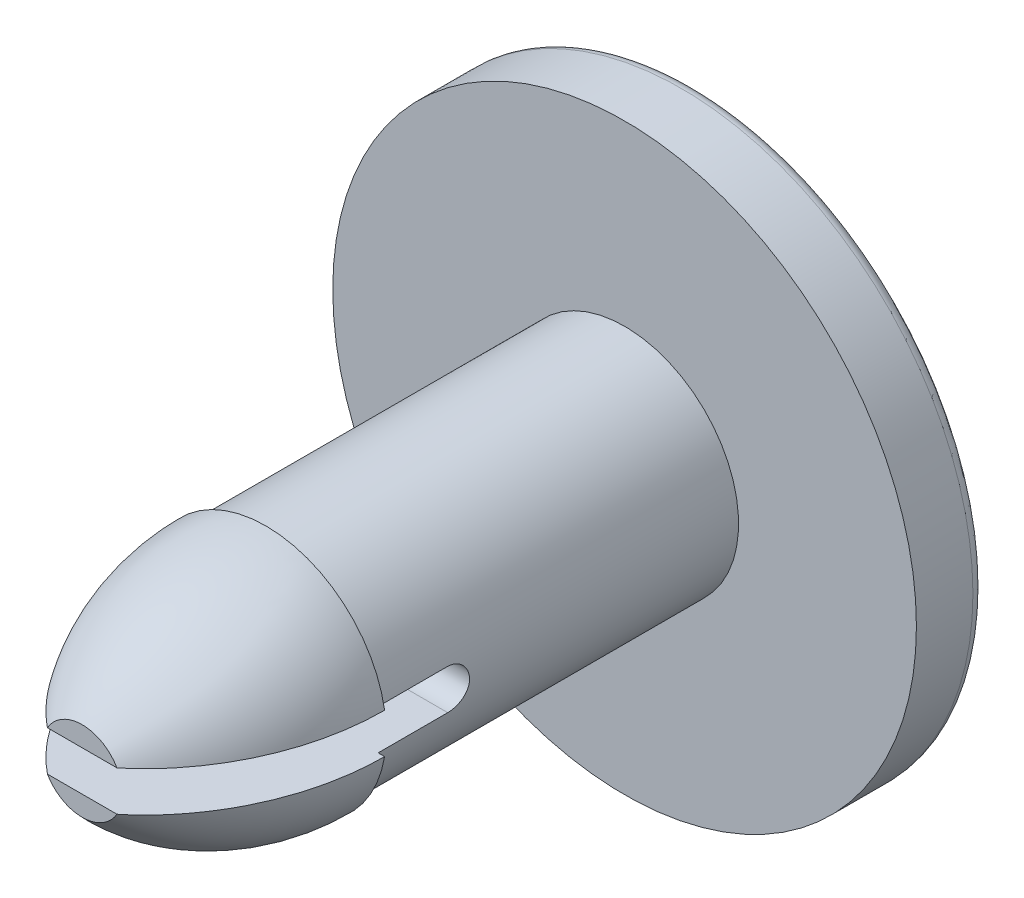
ISO-10303-21;
HEADER;
FILE_DESCRIPTION(('STEP AP214'),'2;1');
FILE_NAME('part.step','',(''),(''),'','','');
FILE_SCHEMA(('AUTOMOTIVE_DESIGN { 1 0 10303 214 1 1 1 1 }'));
ENDSEC;
DATA;
#1=APPLICATION_CONTEXT('core data for automotive mechanical design processes');
#2=APPLICATION_PROTOCOL_DEFINITION('international standard','automotive_design',2000,#1);
#3=PRODUCT_CONTEXT('',#1,'mechanical');
#4=PRODUCT('Part','Part','',(#3));
#5=PRODUCT_RELATED_PRODUCT_CATEGORY('part','',(#4));
#6=PRODUCT_DEFINITION_FORMATION('','',#4);
#7=PRODUCT_DEFINITION_CONTEXT('part definition',#1,'design');
#8=PRODUCT_DEFINITION('design','',#6,#7);
#9=PRODUCT_DEFINITION_SHAPE('','',#8);
#10=(LENGTH_UNIT() NAMED_UNIT(*) SI_UNIT(.MILLI.,.METRE.));
#11=(NAMED_UNIT(*) PLANE_ANGLE_UNIT() SI_UNIT($,.RADIAN.));
#12=(NAMED_UNIT(*) SI_UNIT($,.STERADIAN.) SOLID_ANGLE_UNIT());
#13=UNCERTAINTY_MEASURE_WITH_UNIT(LENGTH_MEASURE(1.E-05),#10,'distance_accuracy_value','');
#14=(GEOMETRIC_REPRESENTATION_CONTEXT(3) GLOBAL_UNCERTAINTY_ASSIGNED_CONTEXT((#13)) GLOBAL_UNIT_ASSIGNED_CONTEXT((#10,
#11,#12)) REPRESENTATION_CONTEXT('',''));
#15=CARTESIAN_POINT('',(0.,0.,0.));
#16=DIRECTION('',(0.,0.,1.));
#17=DIRECTION('',(1.,0.,0.));
#18=AXIS2_PLACEMENT_3D('',#15,#16,#17);
#19=CARTESIAN_POINT('',(0.,0.,15.7988));
#20=DIRECTION('',(0.,0.,1.));
#21=DIRECTION('',(1.,0.,0.));
#22=AXIS2_PLACEMENT_3D('',#19,#20,#21);
#23=PLANE('',#22);
#24=DIRECTION('',(1.,0.,0.));
#25=VECTOR('',#24,1.);
#26=CARTESIAN_POINT('',(-7.5438,0.518583333333335,15.7988));
#27=LINE('',#26,#25);
#28=CARTESIAN_POINT('',(-0.898212681291753,0.518583333333335,15.7988));
#29=VERTEX_POINT('',#28);
#30=CARTESIAN_POINT('',(0.898212681304944,0.518583333333335,15.7988));
#31=VERTEX_POINT('',#30);
#32=EDGE_CURVE('E201',#29,#31,#27,.T.);
#33=ORIENTED_EDGE('',*,*,#32,.T.);
#34=CARTESIAN_POINT('',(0.,0.,15.7988));
#35=DIRECTION('',(0.,0.,-1.));
#36=DIRECTION('',(-1.,0.,0.));
#37=AXIS2_PLACEMENT_3D('',#34,#35,#36);
#38=CIRCLE('',#37,1.03716666666667);
#39=EDGE_CURVE('E158',#29,#31,#38,.T.);
#40=ORIENTED_EDGE('',*,*,#39,.F.);
#41=EDGE_LOOP('',(#33,#40));
#42=FACE_BOUND('',#41,.T.);
#43=ADVANCED_FACE('F39',(#42),#23,.T.);
#44=CARTESIAN_POINT('',(0.,0.,11.049));
#45=DIRECTION('',(0.,0.,-1.));
#46=DIRECTION('',(-1.,0.,0.));
#47=AXIS2_PLACEMENT_3D('',#44,#45,#46);
#48=DEGENERATE_TOROIDAL_SURFACE('',#47,3.36370299319728,6.47520299319728,.F.);
#49=CARTESIAN_POINT('',(0.,0.518583333333335,16.2312877845547));
#50=CARTESIAN_POINT('',(-0.0407264129127319,0.518583333333335,16.231275807815));
#51=CARTESIAN_POINT('',(-0.0814801404673032,0.518583333333335,16.2276080484462));
#52=CARTESIAN_POINT('',(-0.161991821460887,0.518583333333335,16.2137862378775));
#53=CARTESIAN_POINT('',(-0.20174372586801,0.518583333333335,16.2035996113095));
#54=CARTESIAN_POINT('',(-0.28539378906224,0.518583333333335,16.1766545321276));
#55=CARTESIAN_POINT('',(-0.329041860075124,0.518583333333335,16.1591498650331));
#56=CARTESIAN_POINT('',(-0.414482229003522,0.518583333333335,16.1200193953121));
#57=CARTESIAN_POINT('',(-0.456270802394296,0.518583333333335,16.0983857435605));
#58=CARTESIAN_POINT('',(-0.538494216710265,0.518583333333335,16.0521645739479));
#59=CARTESIAN_POINT('',(-0.578919240578408,0.518583333333335,16.0275598362332));
#60=CARTESIAN_POINT('',(-0.658373120750007,0.518583333333335,15.9762786505908));
#61=CARTESIAN_POINT('',(-0.697403056285305,0.518583333333335,15.9496038570284));
#62=CARTESIAN_POINT('',(-0.790884764690187,0.518583333333335,15.8827480789929));
#63=CARTESIAN_POINT('',(-0.844720856627003,0.518583333333335,15.8417074450807));
#64=CARTESIAN_POINT('',(-0.950306360734214,0.518583333333335,15.757014180395));
#65=CARTESIAN_POINT('',(-1.00205503311049,0.518583333333335,15.7133606369709));
#66=CARTESIAN_POINT('',(-1.15454295052778,0.518583333333335,15.5790214828739));
#67=CARTESIAN_POINT('',(-1.25240197811474,0.518583333333335,15.4850476081723));
#68=CARTESIAN_POINT('',(-1.44074748546284,0.518583333333335,15.2902905772841));
#69=CARTESIAN_POINT('',(-1.53124364214776,0.518583333333335,15.189516687886));
#70=CARTESIAN_POINT('',(-1.70497952899168,0.518583333333335,14.9820119862826));
#71=CARTESIAN_POINT('',(-1.78822363623625,0.518583333333335,14.8752848319746));
#72=CARTESIAN_POINT('',(-1.97095158925619,0.518583333333335,14.624119731363));
#73=CARTESIAN_POINT('',(-2.0679522036069,0.518583333333335,14.4778678366797));
#74=CARTESIAN_POINT('',(-2.24926450019187,0.518583333333335,14.1776366154759));
#75=CARTESIAN_POINT('',(-2.33357084744756,0.518583333333335,14.0236540760714));
#76=CARTESIAN_POINT('',(-2.48898247043954,0.518583333333335,13.7092454842928));
#77=CARTESIAN_POINT('',(-2.56009320100576,0.518583333333335,13.5488221279448));
#78=CARTESIAN_POINT('',(-2.68877745678832,0.518583333333335,13.2225675434815));
#79=CARTESIAN_POINT('',(-2.74634583204625,0.518583333333335,13.05673428527));
#80=CARTESIAN_POINT('',(-2.8476811148439,0.518583333333335,12.7205131210003));
#81=CARTESIAN_POINT('',(-2.89141794161705,0.518583333333335,12.5501161503398));
#82=CARTESIAN_POINT('',(-2.96466817080909,0.518583333333335,12.2062291770196));
#83=CARTESIAN_POINT('',(-2.9941764831191,0.518583333333335,12.0327380904529));
#84=CARTESIAN_POINT('',(-3.03875548143213,0.518583333333335,11.6839855612238));
#85=CARTESIAN_POINT('',(-3.05383226093596,0.518583333333335,11.508724897356));
#86=CARTESIAN_POINT('',(-3.06947955149315,0.518583333333335,11.1574921518692));
#87=CARTESIAN_POINT('',(-3.07004461092563,0.518583333333335,10.9815198277292));
#88=CARTESIAN_POINT('',(-3.05652376034,0.518583333333335,10.6267988284575));
#89=CARTESIAN_POINT('',(-3.04216025057819,0.518583333333335,10.4480606701983));
#90=CARTESIAN_POINT('',(-2.99843836333691,0.518583333333335,10.092364626086));
#91=CARTESIAN_POINT('',(-2.96907472774547,0.518583333333336,9.91540738670741));
#92=CARTESIAN_POINT('',(-2.89551917856703,0.518583333333336,9.56450863912886));
#93=CARTESIAN_POINT('',(-2.85131986150213,0.518583333333336,9.39056868231748));
#94=CARTESIAN_POINT('',(-2.74835122154622,0.518583333333336,9.04696507955554));
#95=CARTESIAN_POINT('',(-2.68957503293237,0.518583333333336,8.87730349032453));
#96=CARTESIAN_POINT('',(-2.55781748719599,0.518583333333336,8.5435609922402));
#97=CARTESIAN_POINT('',(-2.48483425263281,0.518583333333336,8.37948082433386));
#98=CARTESIAN_POINT('',(-2.32510097051018,0.518583333333336,8.05816529828079));
#99=CARTESIAN_POINT('',(-2.23835147738078,0.518583333333336,7.90092966479827));
#100=CARTESIAN_POINT('',(-2.05178680713929,0.518583333333336,7.59493939589653));
#101=CARTESIAN_POINT('',(-1.95200409835851,0.518583333333336,7.4461649620269));
#102=CARTESIAN_POINT('',(-1.7397125117805,0.518583333333336,7.15809509517974));
#103=CARTESIAN_POINT('',(-1.62721262726387,0.518583333333336,7.01879307381286));
#104=CARTESIAN_POINT('',(-1.43378276346113,0.518583333333336,6.80095889172777));
#105=CARTESIAN_POINT('',(-1.35662262876072,0.518583333333336,6.71905288089397));
#106=CARTESIAN_POINT('',(-1.1972612353243,0.518583333333336,6.56024999261713));
#107=CARTESIAN_POINT('',(-1.11506010662716,0.518583333333336,6.48335298606586));
#108=CARTESIAN_POINT('',(-0.989792252439972,0.518583333333336,6.37442419714963));
#109=CARTESIAN_POINT('',(-0.94879320426588,0.518583333333336,6.33999988144634));
#110=CARTESIAN_POINT('',(-0.865491244106908,0.518583333333336,6.2727715131478));
#111=CARTESIAN_POINT('',(-0.823188542697885,0.518583333333336,6.23996720108216));
#112=CARTESIAN_POINT('',(-0.737129281728739,0.518583333333336,6.17629560361508));
#113=CARTESIAN_POINT('',(-0.693372423828693,0.518583333333336,6.14542871950271));
#114=CARTESIAN_POINT('',(-0.604203534798896,0.518583333333336,6.08620669951445));
#115=CARTESIAN_POINT('',(-0.5587923317595,0.518583333333336,6.05785033072326));
#116=CARTESIAN_POINT('',(-0.465168333107206,0.518583333333336,6.00417076317695));
#117=CARTESIAN_POINT('',(-0.416921402374916,0.518583333333336,5.97890616774525));
#118=CARTESIAN_POINT('',(-0.317861784463709,0.518583333333336,5.93393875103579));
#119=CARTESIAN_POINT('',(-0.267053266184642,0.518583333333336,5.91422721619489));
#120=CARTESIAN_POINT('',(-0.174398829107425,0.518583333333336,5.88722058760614));
#121=CARTESIAN_POINT('',(-0.133101589112402,0.518583333333336,5.87813146387408));
#122=CARTESIAN_POINT('',(-0.0496292123505532,0.518583333333336,5.86727899520565));
#123=CARTESIAN_POINT('',(-0.00745769984292557,0.518583333333336,5.86548983721711));
#124=CARTESIAN_POINT('',(0.0764557507962241,0.518583333333336,5.8696524310324));
#125=CARTESIAN_POINT('',(0.118197825258675,0.518583333333336,5.8756016446359));
#126=CARTESIAN_POINT('',(0.200368425681853,0.518583333333336,5.89382076039526));
#127=CARTESIAN_POINT('',(0.240790646626667,0.518583333333336,5.90611729945816));
#128=CARTESIAN_POINT('',(0.331322097666327,0.518583333333336,5.93929309618665));
#129=CARTESIAN_POINT('',(0.380880830136704,0.518583333333336,5.96162286795935));
#130=CARTESIAN_POINT('',(0.477709610376274,0.518583333333336,6.01086101444558));
#131=CARTESIAN_POINT('',(0.524974483035573,0.518583333333336,6.03777917535016));
#132=CARTESIAN_POINT('',(0.617885852022556,0.518583333333336,6.09487763166931));
#133=CARTESIAN_POINT('',(0.663520071518955,0.518583333333336,6.12507768019658));
#134=CARTESIAN_POINT('',(0.753117213555999,0.518583333333336,6.18775615933993));
#135=CARTESIAN_POINT('',(0.797081628172564,0.518583333333336,6.22023247841578));
#136=CARTESIAN_POINT('',(0.898444002978826,0.518583333333336,6.29849863657378));
#137=CARTESIAN_POINT('',(0.955269083996176,0.518583333333336,6.34502980065694));
#138=CARTESIAN_POINT('',(1.06661292292584,0.518583333333336,6.44078328658392));
#139=CARTESIAN_POINT('',(1.12113100542112,0.518583333333336,6.49000638700508));
#140=CARTESIAN_POINT('',(1.28153792135015,0.518583333333336,6.64125722979692));
#141=CARTESIAN_POINT('',(1.3841615471152,0.518583333333336,6.74677319073642));
#142=CARTESIAN_POINT('',(1.5806801923919,0.518583333333336,6.96509531641962));
#143=CARTESIAN_POINT('',(1.67459665497695,0.518583333333336,7.07788234574475));
#144=CARTESIAN_POINT('',(1.85384657684704,0.518583333333336,7.30997090116511));
#145=CARTESIAN_POINT('',(1.93918510626747,0.518583333333336,7.42926851395448));
#146=CARTESIAN_POINT('',(2.10293871534261,0.518583333333336,7.67639735644312));
#147=CARTESIAN_POINT('',(2.18115559389323,0.518583333333336,7.80435996822917));
#148=CARTESIAN_POINT('',(2.32818019895601,0.518583333333336,8.06557657178749));
#149=CARTESIAN_POINT('',(2.39698641931057,0.518583333333336,8.19883140617616));
#150=CARTESIAN_POINT('',(2.58888116870131,0.518583333333336,8.60548939807205));
#151=CARTESIAN_POINT('',(2.69750250204437,0.518583333333336,8.88587203469264));
#152=CARTESIAN_POINT('',(2.88964771397096,0.518583333333336,9.50976052334392));
#153=CARTESIAN_POINT('',(2.96536620768084,0.518583333333335,9.85567765519236));
#154=CARTESIAN_POINT('',(3.05864359426403,0.518583333333335,10.5552692528594));
#155=CARTESIAN_POINT('',(3.07619650339095,0.518583333333335,10.9089445130231));
#156=CARTESIAN_POINT('',(3.05250133638668,0.518583333333335,11.6197023602227));
#157=CARTESIAN_POINT('',(3.01036227032898,0.518583333333335,11.9767558675326));
#158=CARTESIAN_POINT('',(2.86668707844602,0.518583333333335,12.6791899421931));
#159=CARTESIAN_POINT('',(2.76506533618463,0.518583333333335,13.0245529232552));
#160=CARTESIAN_POINT('',(2.50461603092907,0.518583333333335,13.6937240398372));
#161=CARTESIAN_POINT('',(2.34572391031139,0.518583333333335,14.0175073598227));
#162=CARTESIAN_POINT('',(2.06795457436586,0.518583333333335,14.4780626640727));
#163=CARTESIAN_POINT('',(1.96899271478333,0.518583333333335,14.6271642386819));
#164=CARTESIAN_POINT('',(1.75832403916917,0.518583333333335,14.9160166534445));
#165=CARTESIAN_POINT('',(1.64662587993108,0.518583333333335,15.0557737437025));
#166=CARTESIAN_POINT('',(1.44175746459423,0.518583333333335,15.2890031721587));
#167=CARTESIAN_POINT('',(1.3514363662105,0.518583333333335,15.3849842851889));
#168=CARTESIAN_POINT('',(1.21055811821162,0.518583333333335,15.5239125244275));
#169=CARTESIAN_POINT('',(1.16257824936559,0.518583333333335,15.5694840577142));
#170=CARTESIAN_POINT('',(1.06482016108486,0.518583333333335,15.6586347126673));
#171=CARTESIAN_POINT('',(1.01504244614222,0.518583333333335,15.7022143856102));
#172=CARTESIAN_POINT('',(0.913102668298245,0.518583333333335,15.7874651385858));
#173=CARTESIAN_POINT('',(0.86092314035411,0.518583333333335,15.8291154426546));
#174=CARTESIAN_POINT('',(0.75430656837218,0.518583333333335,15.9095860159839));
#175=CARTESIAN_POINT('',(0.699866562927882,0.518583333333335,15.9484023764751));
#176=CARTESIAN_POINT('',(0.588662451524345,0.518583333333335,16.0219579758186));
#177=CARTESIAN_POINT('',(0.531912869991846,0.518583333333335,16.0567185832468));
#178=CARTESIAN_POINT('',(0.444387730764145,0.518583333333335,16.104318591653));
#179=CARTESIAN_POINT('',(0.414844055320709,0.518583333333335,16.1194152913019));
#180=CARTESIAN_POINT('',(0.354830181135616,0.518583333333335,16.1476204201236));
#181=CARTESIAN_POINT('',(0.32436066513663,0.518583333333335,16.1607302736955));
#182=CARTESIAN_POINT('',(0.26986073404642,0.518583333333335,16.1814669783519));
#183=CARTESIAN_POINT('',(0.246045228508195,0.518583333333335,16.1896540990776));
#184=CARTESIAN_POINT('',(0.19783512986225,0.518583333333335,16.2041266804244));
#185=CARTESIAN_POINT('',(0.173440593290915,0.518583333333335,16.2104123258879));
#186=CARTESIAN_POINT('',(0.124339788511118,0.518583333333335,16.2206404086077));
#187=CARTESIAN_POINT('',(0.0996371100177838,0.518583333333335,16.224599663777));
#188=CARTESIAN_POINT('',(0.0499596506241167,0.518583333333335,16.2299265837947));
#189=CARTESIAN_POINT('',(0.0249849654017718,0.518583333333335,16.2312951320818));
#190=CARTESIAN_POINT('',(0.,0.518583333333335,16.2312877845547));
#191=B_SPLINE_CURVE_WITH_KNOTS('',3,(#49,#50,#51,#52,#53,#54,#55,#56,#57,#58,#59,#60,#61,#62,
#63,#64,#65,#66,#67,#68,#69,#70,#71,#72,#73,#74,#75,#76,#77,#78,#79,#80,#81,#82,#83,#84,#85,#86,
#87,#88,#89,#90,#91,#92,#93,#94,#95,#96,#97,#98,#99,#100,#101,#102,#103,#104,#105,#106,#107,
#108,#109,#110,#111,#112,#113,#114,#115,#116,#117,#118,#119,#120,#121,#122,#123,#124,#125,#126,
#127,#128,#129,#130,#131,#132,#133,#134,#135,#136,#137,#138,#139,#140,#141,#142,#143,#144,#145,
#146,#147,#148,#149,#150,#151,#152,#153,#154,#155,#156,#157,#158,#159,#160,#161,#162,#163,#164,
#165,#166,#167,#168,#169,#170,#171,#172,#173,#174,#175,#176,#177,#178,#179,#180,#181,#182,#183,
#184,#185,#186,#187,#188,#189,#190),.UNSPECIFIED.,.T.,.F.,(4,2,2,2,2,2,2,2,2,2,2,2,2,2,2,2,2,2,
2,2,2,2,2,2,2,2,2,2,2,2,2,2,2,2,2,2,2,2,2,2,2,2,2,2,2,2,2,2,2,2,2,2,2,2,2,2,2,2,2,2,2,2,2,2,2,2,
2,2,2,2,4),(0.,0.122093544579893,0.244802017027031,0.385558203600591,0.526584679348972,
0.668471744728991,0.81024656077593,1.01322151904397,1.21626779192196,1.6228142819017,
2.02881751897094,2.43457398382444,2.9603935602371,3.48643350802382,4.01225551358537,
4.53827715942247,5.06543504965097,5.59278138569053,6.11990495920832,6.64722655445262,
7.18453230282875,7.7220265265861,8.25978937686671,8.79780599668946,9.33589376295792,
9.87395986347406,10.4107102271114,10.9470833607764,11.2844860093013,11.6218799577523,
11.7824533038558,11.9430008475096,12.1035815355239,12.2640829196981,12.4272663332283,
12.5901922434959,12.7165410473725,12.8424426861643,12.9683030393952,13.0946959192779,
13.2573741330503,13.4204037531956,13.5844755347724,13.7483970826508,13.9686241365766,
14.188915226211,14.6299468441494,15.069861761172,15.5095151107193,15.9590288173463,
16.4086143837919,17.3074793485365,18.3648789789601,19.4223873853011,20.4958479988905,
21.5708575115243,22.647082630312,23.1833905919128,23.7193361767446,24.1143820981797,
24.3128547653705,24.5112721655365,24.7114803800176,24.9119597134388,25.1113298942166,
25.2108113128698,25.3102210709784,25.385708889572,25.4611893676367,25.5361172471595,
25.6110195714483),.UNSPECIFIED.);
#192=CARTESIAN_POINT('',(-3.06798037418574,0.518583333333335,11.049));
#193=VERTEX_POINT('',#192);
#194=EDGE_CURVE('E176',#29,#193,#191,.T.);
#195=ORIENTED_EDGE('',*,*,#194,.F.);
#196=ORIENTED_EDGE('',*,*,#39,.T.);
#197=CARTESIAN_POINT('',(3.06798037418574,0.518583333333335,11.049));
#198=VERTEX_POINT('',#197);
#199=EDGE_CURVE('E175',#198,#31,#191,.T.);
#200=ORIENTED_EDGE('',*,*,#199,.F.);
#201=CARTESIAN_POINT('',(0.,0.,11.049));
#202=DIRECTION('',(0.,0.,-1.));
#203=DIRECTION('',(-1.,0.,0.));
#204=AXIS2_PLACEMENT_3D('',#201,#202,#203);
#205=CIRCLE('',#204,3.1115);
#206=EDGE_CURVE('E162',#193,#198,#205,.T.);
#207=ORIENTED_EDGE('',*,*,#206,.F.);
#208=EDGE_LOOP('',(#195,#196,#200,#207));
#209=FACE_BOUND('',#208,.T.);
#210=ADVANCED_FACE('F191',(#209),#48,.F.);
#211=CARTESIAN_POINT('',(0.,3.1115,11.049));
#212=DIRECTION('',(0.,0.,-1.));
#213=DIRECTION('',(-1.,0.,0.));
#214=AXIS2_PLACEMENT_3D('',#211,#212,#213);
#215=PLANE('',#214);
#216=DIRECTION('',(1.,0.,0.));
#217=VECTOR('',#216,1.);
#218=CARTESIAN_POINT('',(0.,0.518583333333335,11.049));
#219=LINE('',#218,#217);
#220=CARTESIAN_POINT('',(-2.90040415914556,0.518583333333336,11.049));
#221=VERTEX_POINT('',#220);
#222=EDGE_CURVE('E182',#193,#221,#219,.T.);
#223=ORIENTED_EDGE('',*,*,#222,.F.);
#224=ORIENTED_EDGE('',*,*,#206,.T.);
#225=CARTESIAN_POINT('',(2.90040415914556,0.518583333333336,11.049));
#226=VERTEX_POINT('',#225);
#227=EDGE_CURVE('E62',#226,#198,#219,.T.);
#228=ORIENTED_EDGE('',*,*,#227,.F.);
#229=CARTESIAN_POINT('',(0.,0.,11.049));
#230=DIRECTION('',(0.,0.,-1.));
#231=DIRECTION('',(-1.,0.,0.));
#232=AXIS2_PLACEMENT_3D('',#229,#230,#231);
#233=CIRCLE('',#232,2.9464);
#234=EDGE_CURVE('E166',#221,#226,#233,.T.);
#235=ORIENTED_EDGE('',*,*,#234,.F.);
#236=EDGE_LOOP('',(#223,#224,#228,#235));
#237=FACE_BOUND('',#236,.T.);
#238=ADVANCED_FACE('F213',(#237),#215,.T.);
#239=CARTESIAN_POINT('',(0.,7.5438,0.));
#240=DIRECTION('',(0.,0.,-1.));
#241=DIRECTION('',(-1.,0.,0.));
#242=AXIS2_PLACEMENT_3D('',#239,#240,#241);
#243=PLANE('',#242);
#244=CARTESIAN_POINT('',(0.,0.,0.));
#245=DIRECTION('',(0.,0.,-1.));
#246=DIRECTION('',(-1.,0.,0.));
#247=AXIS2_PLACEMENT_3D('',#244,#245,#246);
#248=CIRCLE('',#247,7.2263);
#249=CARTESIAN_POINT('',(-7.2263,0.,0.));
#250=VERTEX_POINT('',#249);
#251=EDGE_CURVE('E47',#250,#250,#248,.T.);
#252=ORIENTED_EDGE('',*,*,#251,.T.);
#253=EDGE_LOOP('',(#252));
#254=FACE_BOUND('',#253,.T.);
#255=ADVANCED_FACE('F228',(#254),#243,.T.);
#256=DIRECTION('',(1.,0.,0.));
#257=VECTOR('',#256,1.);
#258=CARTESIAN_POINT('',(-7.5438,-0.518583333333335,15.7988));
#259=LINE('',#258,#257);
#260=CARTESIAN_POINT('',(-0.898212681304944,-0.518583333333335,15.7988));
#261=VERTEX_POINT('',#260);
#262=CARTESIAN_POINT('',(0.898212681291753,-0.518583333333335,15.7988));
#263=VERTEX_POINT('',#262);
#264=EDGE_CURVE('E121',#261,#263,#259,.T.);
#265=ORIENTED_EDGE('',*,*,#264,.F.);
#266=EDGE_CURVE('E161',#263,#261,#38,.T.);
#267=ORIENTED_EDGE('',*,*,#266,.F.);
#268=EDGE_LOOP('',(#265,#267));
#269=FACE_BOUND('',#268,.T.);
#270=ADVANCED_FACE('F189',(#269),#23,.T.);
#271=CARTESIAN_POINT('',(0.,-0.518583333333335,16.2312877845547));
#272=CARTESIAN_POINT('',(0.0407264129127319,-0.518583333333335,16.231275807815));
#273=CARTESIAN_POINT('',(0.0814801404673032,-0.518583333333335,16.2276080484462));
#274=CARTESIAN_POINT('',(0.161991821460887,-0.518583333333335,16.2137862378775));
#275=CARTESIAN_POINT('',(0.20174372586801,-0.518583333333335,16.2035996113095));
#276=CARTESIAN_POINT('',(0.28539378906224,-0.518583333333335,16.1766545321276));
#277=CARTESIAN_POINT('',(0.329041860075124,-0.518583333333335,16.1591498650331));
#278=CARTESIAN_POINT('',(0.414482229003522,-0.518583333333335,16.1200193953121));
#279=CARTESIAN_POINT('',(0.456270802394296,-0.518583333333335,16.0983857435605));
#280=CARTESIAN_POINT('',(0.538494216710265,-0.518583333333335,16.0521645739479));
#281=CARTESIAN_POINT('',(0.578919240578408,-0.518583333333335,16.0275598362332));
#282=CARTESIAN_POINT('',(0.658373120750007,-0.518583333333335,15.9762786505908));
#283=CARTESIAN_POINT('',(0.697403056285305,-0.518583333333335,15.9496038570284));
#284=CARTESIAN_POINT('',(0.790884764690187,-0.518583333333335,15.8827480789929));
#285=CARTESIAN_POINT('',(0.844720856627003,-0.518583333333335,15.8417074450807));
#286=CARTESIAN_POINT('',(0.950306360734214,-0.518583333333335,15.757014180395));
#287=CARTESIAN_POINT('',(1.00205503311049,-0.518583333333335,15.7133606369709));
#288=CARTESIAN_POINT('',(1.15454295052778,-0.518583333333335,15.5790214828739));
#289=CARTESIAN_POINT('',(1.25240197811474,-0.518583333333335,15.4850476081723));
#290=CARTESIAN_POINT('',(1.44074748546284,-0.518583333333335,15.2902905772841));
#291=CARTESIAN_POINT('',(1.53124364214776,-0.518583333333335,15.189516687886));
#292=CARTESIAN_POINT('',(1.70497952899168,-0.518583333333335,14.9820119862826));
#293=CARTESIAN_POINT('',(1.78822363623625,-0.518583333333335,14.8752848319746));
#294=CARTESIAN_POINT('',(1.97095158925619,-0.518583333333335,14.624119731363));
#295=CARTESIAN_POINT('',(2.0679522036069,-0.518583333333335,14.4778678366797));
#296=CARTESIAN_POINT('',(2.24926450019187,-0.518583333333335,14.1776366154759));
#297=CARTESIAN_POINT('',(2.33357084744756,-0.518583333333335,14.0236540760714));
#298=CARTESIAN_POINT('',(2.48898247043954,-0.518583333333335,13.7092454842928));
#299=CARTESIAN_POINT('',(2.56009320100576,-0.518583333333335,13.5488221279448));
#300=CARTESIAN_POINT('',(2.68877745678832,-0.518583333333335,13.2225675434815));
#301=CARTESIAN_POINT('',(2.74634583204625,-0.518583333333335,13.05673428527));
#302=CARTESIAN_POINT('',(2.8476811148439,-0.518583333333335,12.7205131210003));
#303=CARTESIAN_POINT('',(2.89141794161705,-0.518583333333335,12.5501161503398));
#304=CARTESIAN_POINT('',(2.96466817080909,-0.518583333333335,12.2062291770196));
#305=CARTESIAN_POINT('',(2.9941764831191,-0.518583333333335,12.0327380904529));
#306=CARTESIAN_POINT('',(3.03875548143213,-0.518583333333335,11.6839855612238));
#307=CARTESIAN_POINT('',(3.05383226093596,-0.518583333333335,11.508724897356));
#308=CARTESIAN_POINT('',(3.06947955149315,-0.518583333333335,11.1574921518692));
#309=CARTESIAN_POINT('',(3.07004461092563,-0.518583333333335,10.9815198277292));
#310=CARTESIAN_POINT('',(3.05652376034,-0.518583333333335,10.6267988284575));
#311=CARTESIAN_POINT('',(3.04216025057819,-0.518583333333335,10.4480606701983));
#312=CARTESIAN_POINT('',(2.99843836333691,-0.518583333333335,10.092364626086));
#313=CARTESIAN_POINT('',(2.96907472774547,-0.518583333333336,9.91540738670741));
#314=CARTESIAN_POINT('',(2.89551917856703,-0.518583333333336,9.56450863912886));
#315=CARTESIAN_POINT('',(2.85131986150213,-0.518583333333336,9.39056868231748));
#316=CARTESIAN_POINT('',(2.74835122154622,-0.518583333333336,9.04696507955554));
#317=CARTESIAN_POINT('',(2.68957503293237,-0.518583333333336,8.87730349032453));
#318=CARTESIAN_POINT('',(2.55781748719599,-0.518583333333336,8.5435609922402));
#319=CARTESIAN_POINT('',(2.48483425263281,-0.518583333333336,8.37948082433386));
#320=CARTESIAN_POINT('',(2.32510097051018,-0.518583333333336,8.05816529828079));
#321=CARTESIAN_POINT('',(2.23835147738078,-0.518583333333336,7.90092966479827));
#322=CARTESIAN_POINT('',(2.05178680713929,-0.518583333333336,7.59493939589653));
#323=CARTESIAN_POINT('',(1.95200409835851,-0.518583333333336,7.4461649620269));
#324=CARTESIAN_POINT('',(1.7397125117805,-0.518583333333336,7.15809509517974));
#325=CARTESIAN_POINT('',(1.62721262726387,-0.518583333333336,7.01879307381286));
#326=CARTESIAN_POINT('',(1.43378276346113,-0.518583333333336,6.80095889172777));
#327=CARTESIAN_POINT('',(1.35662262876072,-0.518583333333336,6.71905288089397));
#328=CARTESIAN_POINT('',(1.1972612353243,-0.518583333333336,6.56024999261713));
#329=CARTESIAN_POINT('',(1.11506010662716,-0.518583333333336,6.48335298606586));
#330=CARTESIAN_POINT('',(0.989792252439972,-0.518583333333336,6.37442419714963));
#331=CARTESIAN_POINT('',(0.94879320426588,-0.518583333333336,6.33999988144634));
#332=CARTESIAN_POINT('',(0.865491244106908,-0.518583333333336,6.2727715131478));
#333=CARTESIAN_POINT('',(0.823188542697885,-0.518583333333336,6.23996720108216));
#334=CARTESIAN_POINT('',(0.737129281728739,-0.518583333333336,6.17629560361508));
#335=CARTESIAN_POINT('',(0.693372423828693,-0.518583333333336,6.14542871950271));
#336=CARTESIAN_POINT('',(0.604203534798896,-0.518583333333336,6.08620669951445));
#337=CARTESIAN_POINT('',(0.5587923317595,-0.518583333333336,6.05785033072326));
#338=CARTESIAN_POINT('',(0.465168333107206,-0.518583333333336,6.00417076317695));
#339=CARTESIAN_POINT('',(0.416921402374916,-0.518583333333336,5.97890616774525));
#340=CARTESIAN_POINT('',(0.317861784463709,-0.518583333333336,5.93393875103579));
#341=CARTESIAN_POINT('',(0.267053266184642,-0.518583333333336,5.91422721619489));
#342=CARTESIAN_POINT('',(0.174398829107425,-0.518583333333336,5.88722058760614));
#343=CARTESIAN_POINT('',(0.133101589112402,-0.518583333333336,5.87813146387408));
#344=CARTESIAN_POINT('',(0.0496292123505532,-0.518583333333336,5.86727899520565));
#345=CARTESIAN_POINT('',(0.00745769984292557,-0.518583333333336,5.86548983721711));
#346=CARTESIAN_POINT('',(-0.0764557507962241,-0.518583333333336,5.8696524310324));
#347=CARTESIAN_POINT('',(-0.118197825258675,-0.518583333333336,5.8756016446359));
#348=CARTESIAN_POINT('',(-0.200368425681853,-0.518583333333336,5.89382076039526));
#349=CARTESIAN_POINT('',(-0.240790646626667,-0.518583333333336,5.90611729945816));
#350=CARTESIAN_POINT('',(-0.331322097666327,-0.518583333333336,5.93929309618665));
#351=CARTESIAN_POINT('',(-0.380880830136704,-0.518583333333336,5.96162286795935));
#352=CARTESIAN_POINT('',(-0.477709610376274,-0.518583333333336,6.01086101444558));
#353=CARTESIAN_POINT('',(-0.524974483035573,-0.518583333333336,6.03777917535016));
#354=CARTESIAN_POINT('',(-0.617885852022556,-0.518583333333336,6.09487763166931));
#355=CARTESIAN_POINT('',(-0.663520071518955,-0.518583333333336,6.12507768019658));
#356=CARTESIAN_POINT('',(-0.753117213555999,-0.518583333333336,6.18775615933993));
#357=CARTESIAN_POINT('',(-0.797081628172564,-0.518583333333336,6.22023247841578));
#358=CARTESIAN_POINT('',(-0.898444002978826,-0.518583333333336,6.29849863657378));
#359=CARTESIAN_POINT('',(-0.955269083996176,-0.518583333333336,6.34502980065694));
#360=CARTESIAN_POINT('',(-1.06661292292584,-0.518583333333336,6.44078328658392));
#361=CARTESIAN_POINT('',(-1.12113100542112,-0.518583333333336,6.49000638700508));
#362=CARTESIAN_POINT('',(-1.28153792135015,-0.518583333333336,6.64125722979692));
#363=CARTESIAN_POINT('',(-1.3841615471152,-0.518583333333336,6.74677319073642));
#364=CARTESIAN_POINT('',(-1.5806801923919,-0.518583333333336,6.96509531641962));
#365=CARTESIAN_POINT('',(-1.67459665497695,-0.518583333333336,7.07788234574475));
#366=CARTESIAN_POINT('',(-1.85384657684704,-0.518583333333336,7.30997090116511));
#367=CARTESIAN_POINT('',(-1.93918510626747,-0.518583333333336,7.42926851395448));
#368=CARTESIAN_POINT('',(-2.10293871534261,-0.518583333333336,7.67639735644312));
#369=CARTESIAN_POINT('',(-2.18115559389323,-0.518583333333336,7.80435996822917));
#370=CARTESIAN_POINT('',(-2.32818019895601,-0.518583333333336,8.06557657178749));
#371=CARTESIAN_POINT('',(-2.39698641931057,-0.518583333333336,8.19883140617616));
#372=CARTESIAN_POINT('',(-2.58888116870131,-0.518583333333336,8.60548939807205));
#373=CARTESIAN_POINT('',(-2.69750250204437,-0.518583333333336,8.88587203469264));
#374=CARTESIAN_POINT('',(-2.88964771397096,-0.518583333333336,9.50976052334392));
#375=CARTESIAN_POINT('',(-2.96536620768084,-0.518583333333335,9.85567765519236));
#376=CARTESIAN_POINT('',(-3.05864359426403,-0.518583333333335,10.5552692528594));
#377=CARTESIAN_POINT('',(-3.07619650339095,-0.518583333333335,10.9089445130231));
#378=CARTESIAN_POINT('',(-3.05250133638668,-0.518583333333335,11.6197023602227));
#379=CARTESIAN_POINT('',(-3.01036227032898,-0.518583333333335,11.9767558675326));
#380=CARTESIAN_POINT('',(-2.86668707844602,-0.518583333333335,12.6791899421931));
#381=CARTESIAN_POINT('',(-2.76506533618463,-0.518583333333335,13.0245529232552));
#382=CARTESIAN_POINT('',(-2.50461603092907,-0.518583333333335,13.6937240398372));
#383=CARTESIAN_POINT('',(-2.34572391031139,-0.518583333333335,14.0175073598227));
#384=CARTESIAN_POINT('',(-2.06795457436586,-0.518583333333335,14.4780626640727));
#385=CARTESIAN_POINT('',(-1.96899271478333,-0.518583333333335,14.6271642386819));
#386=CARTESIAN_POINT('',(-1.75832403916917,-0.518583333333335,14.9160166534445));
#387=CARTESIAN_POINT('',(-1.64662587993108,-0.518583333333335,15.0557737437025));
#388=CARTESIAN_POINT('',(-1.44175746459423,-0.518583333333335,15.2890031721587));
#389=CARTESIAN_POINT('',(-1.3514363662105,-0.518583333333335,15.3849842851889));
#390=CARTESIAN_POINT('',(-1.21055811821162,-0.518583333333335,15.5239125244275));
#391=CARTESIAN_POINT('',(-1.16257824936559,-0.518583333333335,15.5694840577142));
#392=CARTESIAN_POINT('',(-1.06482016108486,-0.518583333333335,15.6586347126673));
#393=CARTESIAN_POINT('',(-1.01504244614222,-0.518583333333335,15.7022143856102));
#394=CARTESIAN_POINT('',(-0.913102668298245,-0.518583333333335,15.7874651385858));
#395=CARTESIAN_POINT('',(-0.86092314035411,-0.518583333333335,15.8291154426546));
#396=CARTESIAN_POINT('',(-0.75430656837218,-0.518583333333335,15.9095860159839));
#397=CARTESIAN_POINT('',(-0.699866562927882,-0.518583333333335,15.9484023764751));
#398=CARTESIAN_POINT('',(-0.588662451524345,-0.518583333333335,16.0219579758186));
#399=CARTESIAN_POINT('',(-0.531912869991846,-0.518583333333335,16.0567185832468));
#400=CARTESIAN_POINT('',(-0.444387730764145,-0.518583333333335,16.104318591653));
#401=CARTESIAN_POINT('',(-0.414844055320709,-0.518583333333335,16.1194152913019));
#402=CARTESIAN_POINT('',(-0.354830181135616,-0.518583333333335,16.1476204201236));
#403=CARTESIAN_POINT('',(-0.32436066513663,-0.518583333333335,16.1607302736955));
#404=CARTESIAN_POINT('',(-0.26986073404642,-0.518583333333335,16.1814669783519));
#405=CARTESIAN_POINT('',(-0.246045228508195,-0.518583333333335,16.1896540990776));
#406=CARTESIAN_POINT('',(-0.19783512986225,-0.518583333333335,16.2041266804244));
#407=CARTESIAN_POINT('',(-0.173440593290915,-0.518583333333335,16.2104123258879));
#408=CARTESIAN_POINT('',(-0.124339788511118,-0.518583333333335,16.2206404086077));
#409=CARTESIAN_POINT('',(-0.0996371100177838,-0.518583333333335,16.224599663777));
#410=CARTESIAN_POINT('',(-0.0499596506241167,-0.518583333333335,16.2299265837947));
#411=CARTESIAN_POINT('',(-0.0249849654017718,-0.518583333333335,16.2312951320818));
#412=CARTESIAN_POINT('',(0.,-0.518583333333335,16.2312877845547));
#413=B_SPLINE_CURVE_WITH_KNOTS('',3,(#271,#272,#273,#274,#275,#276,#277,#278,#279,#280,#281,
#282,#283,#284,#285,#286,#287,#288,#289,#290,#291,#292,#293,#294,#295,#296,#297,#298,#299,#300,
#301,#302,#303,#304,#305,#306,#307,#308,#309,#310,#311,#312,#313,#314,#315,#316,#317,#318,#319,
#320,#321,#322,#323,#324,#325,#326,#327,#328,#329,#330,#331,#332,#333,#334,#335,#336,#337,#338,
#339,#340,#341,#342,#343,#344,#345,#346,#347,#348,#349,#350,#351,#352,#353,#354,#355,#356,#357,
#358,#359,#360,#361,#362,#363,#364,#365,#366,#367,#368,#369,#370,#371,#372,#373,#374,#375,#376,
#377,#378,#379,#380,#381,#382,#383,#384,#385,#386,#387,#388,#389,#390,#391,#392,#393,#394,#395,
#396,#397,#398,#399,#400,#401,#402,#403,#404,#405,#406,#407,#408,#409,#410,#411,#412),
.UNSPECIFIED.,.T.,.F.,(4,2,2,2,2,2,2,2,2,2,2,2,2,2,2,2,2,2,2,2,2,2,2,2,2,2,2,2,2,2,2,2,2,2,2,2,
2,2,2,2,2,2,2,2,2,2,2,2,2,2,2,2,2,2,2,2,2,2,2,2,2,2,2,2,2,2,2,2,2,2,4),(0.,0.122093544579893,
0.244802017027031,0.385558203600591,0.526584679348972,0.668471744728991,0.81024656077593,
1.01322151904397,1.21626779192196,1.6228142819017,2.02881751897094,2.43457398382444,
2.9603935602371,3.48643350802382,4.01225551358537,4.53827715942247,5.06543504965097,
5.59278138569053,6.11990495920832,6.64722655445262,7.18453230282875,7.7220265265861,
8.25978937686671,8.79780599668946,9.33589376295792,9.87395986347406,10.4107102271114,
10.9470833607764,11.2844860093013,11.6218799577523,11.7824533038558,11.9430008475096,
12.1035815355239,12.2640829196981,12.4272663332283,12.5901922434959,12.7165410473725,
12.8424426861643,12.9683030393952,13.0946959192779,13.2573741330503,13.4204037531956,
13.5844755347724,13.7483970826508,13.9686241365766,14.188915226211,14.6299468441494,
15.069861761172,15.5095151107193,15.9590288173463,16.4086143837919,17.3074793485365,
18.3648789789601,19.4223873853011,20.4958479988905,21.5708575115243,22.647082630312,
23.1833905919128,23.7193361767446,24.1143820981797,24.3128547653705,24.5112721655365,
24.7114803800176,24.9119597134388,25.1113298942166,25.2108113128698,25.3102210709784,
25.385708889572,25.4611893676367,25.5361172471595,25.6110195714483),.UNSPECIFIED.);
#414=CARTESIAN_POINT('',(3.06798037418574,-0.518583333333335,11.049));
#415=VERTEX_POINT('',#414);
#416=EDGE_CURVE('E193',#263,#415,#413,.T.);
#417=ORIENTED_EDGE('',*,*,#416,.F.);
#418=ORIENTED_EDGE('',*,*,#266,.T.);
#419=CARTESIAN_POINT('',(-3.06798037418574,-0.518583333333335,11.049));
#420=VERTEX_POINT('',#419);
#421=EDGE_CURVE('E199',#420,#261,#413,.T.);
#422=ORIENTED_EDGE('',*,*,#421,.F.);
#423=EDGE_CURVE('E165',#415,#420,#205,.T.);
#424=ORIENTED_EDGE('',*,*,#423,.F.);
#425=EDGE_LOOP('',(#417,#418,#422,#424));
#426=FACE_BOUND('',#425,.T.);
#427=ADVANCED_FACE('F184',(#426),#48,.F.);
#428=DIRECTION('',(-1.,0.,0.));
#429=VECTOR('',#428,1.);
#430=CARTESIAN_POINT('',(0.,-0.518583333333335,11.049));
#431=LINE('',#430,#429);
#432=CARTESIAN_POINT('',(2.90040415914556,-0.518583333333336,11.049));
#433=VERTEX_POINT('',#432);
#434=EDGE_CURVE('E54',#415,#433,#431,.T.);
#435=ORIENTED_EDGE('',*,*,#434,.F.);
#436=ORIENTED_EDGE('',*,*,#423,.T.);
#437=CARTESIAN_POINT('',(-2.90040415914556,-0.518583333333336,11.049));
#438=VERTEX_POINT('',#437);
#439=EDGE_CURVE('E198',#438,#420,#431,.T.);
#440=ORIENTED_EDGE('',*,*,#439,.F.);
#441=EDGE_CURVE('E127',#433,#438,#233,.T.);
#442=ORIENTED_EDGE('',*,*,#441,.F.);
#443=EDGE_LOOP('',(#435,#436,#440,#442));
#444=FACE_BOUND('',#443,.T.);
#445=ADVANCED_FACE('F188',(#444),#215,.T.);
#446=CARTESIAN_POINT('',(0.,0.,0.));
#447=DIRECTION('',(0.,0.,-1.));
#448=DIRECTION('',(-1.,0.,0.));
#449=AXIS2_PLACEMENT_3D('',#446,#447,#448);
#450=CYLINDRICAL_SURFACE('',#449,2.9464);
#451=DIRECTION('',(0.,0.,-1.));
#452=VECTOR('',#451,1.);
#453=CARTESIAN_POINT('',(-2.90040415914556,0.518583333333336,0.));
#454=LINE('',#453,#452);
#455=CARTESIAN_POINT('',(-2.90040415914556,0.518583333333336,9.24983333333334));
#456=VERTEX_POINT('',#455);
#457=EDGE_CURVE('E115',#221,#456,#454,.T.);
#458=ORIENTED_EDGE('',*,*,#457,.F.);
#459=ORIENTED_EDGE('',*,*,#234,.T.);
#460=DIRECTION('',(0.,0.,-1.));
#461=VECTOR('',#460,1.);
#462=CARTESIAN_POINT('',(2.90040415914556,0.518583333333336,0.));
#463=LINE('',#462,#461);
#464=CARTESIAN_POINT('',(2.90040415914556,0.518583333333336,9.24983333333334));
#465=VERTEX_POINT('',#464);
#466=EDGE_CURVE('E128',#465,#226,#463,.F.);
#467=ORIENTED_EDGE('',*,*,#466,.F.);
#468=CARTESIAN_POINT('',(2.90040415914556,-0.518583333333336,9.24983333333334));
#469=CARTESIAN_POINT('',(2.90038720644846,-0.518609167933739,9.22089844163363));
#470=CARTESIAN_POINT('',(2.90083669261155,-0.516163323053275,9.19197610892703));
#471=CARTESIAN_POINT('',(2.90254164603513,-0.506525117584885,9.13499698628489));
#472=CARTESIAN_POINT('',(2.90379600167614,-0.499339303070122,9.10693905843085));
#473=CARTESIAN_POINT('',(2.906984749412,-0.480415207260695,9.05243979659045));
#474=CARTESIAN_POINT('',(2.90891927149372,-0.468676055731759,9.02599877274593));
#475=CARTESIAN_POINT('',(2.91324434589172,-0.44099568030181,8.97545907514865));
#476=CARTESIAN_POINT('',(2.91563491500332,-0.425054301632803,8.95136048771257));
#477=CARTESIAN_POINT('',(2.92063300793715,-0.389235926995564,8.90593074485225));
#478=CARTESIAN_POINT('',(2.92324241442597,-0.369322188813996,8.88462876042359));
#479=CARTESIAN_POINT('',(2.92836743293011,-0.32620209838987,8.84564810882313));
#480=CARTESIAN_POINT('',(2.93088303048455,-0.302995241132884,8.82796999840687));
#481=CARTESIAN_POINT('',(2.93555701341019,-0.253757006467504,8.79663000491575));
#482=CARTESIAN_POINT('',(2.93771290641944,-0.227707835856546,8.78299567305891));
#483=CARTESIAN_POINT('',(2.94140326240683,-0.17364601544592,8.76030820651466));
#484=CARTESIAN_POINT('',(2.9429378053128,-0.145633618731444,8.75125448256));
#485=CARTESIAN_POINT('',(2.94519934284806,-0.0887439779889792,8.73807465276646));
#486=CARTESIAN_POINT('',(2.94593445681169,-0.0598785476093113,8.73389897057322));
#487=CARTESIAN_POINT('',(2.94654225084338,-0.00184737708212998,8.73043943671023));
#488=CARTESIAN_POINT('',(2.94641497563321,0.0273183474144166,8.73115533137315));
#489=CARTESIAN_POINT('',(2.94531869123311,0.0847812981404167,8.73742042553935));
#490=CARTESIAN_POINT('',(2.94435899844374,0.113084559988153,8.74291613133722));
#491=CARTESIAN_POINT('',(2.94171613266455,0.168360623057927,8.75850041467357));
#492=CARTESIAN_POINT('',(2.94003294049025,0.195333388979076,8.76858911400139));
#493=CARTESIAN_POINT('',(2.93611642858812,0.247340821997631,8.79312539013045));
#494=CARTESIAN_POINT('',(2.93388036418078,0.272364974583988,8.80759479752206));
#495=CARTESIAN_POINT('',(2.92910616137964,0.319649249598239,8.84046523881386));
#496=CARTESIAN_POINT('',(2.92656800663707,0.34190922229871,8.85886648554338));
#497=CARTESIAN_POINT('',(2.92143112347903,0.383348052259024,8.89937133837046));
#498=CARTESIAN_POINT('',(2.918832039154,0.402481612459483,8.92152126339677));
#499=CARTESIAN_POINT('',(2.91389822849636,0.436773691629813,8.9687479722551));
#500=CARTESIAN_POINT('',(2.91156357697347,0.451931087305605,8.99382558029274));
#501=CARTESIAN_POINT('',(2.90742227644196,0.477851403992071,9.04625516564294));
#502=CARTESIAN_POINT('',(2.90561665069699,0.48860582433545,9.07361142091797));
#503=CARTESIAN_POINT('',(2.90275372366121,0.505338563045156,9.12976272810078));
#504=CARTESIAN_POINT('',(2.90169530529034,0.511324012785096,9.15855556301329));
#505=CARTESIAN_POINT('',(2.90084959340318,0.516086645027974,9.19794753733802));
#506=CARTESIAN_POINT('',(2.90068271347756,0.517023277499134,9.20831102248795));
#507=CARTESIAN_POINT('',(2.90046010371183,0.51827081416622,9.22905925952555));
#508=CARTESIAN_POINT('',(2.90040418702944,0.518582770213719,9.23944394614018));
#509=CARTESIAN_POINT('',(2.90040415914557,0.518583333333336,9.24983333333333));
#510=B_SPLINE_CURVE_WITH_KNOTS('',3,(#468,#469,#470,#471,#472,#473,#474,#475,#476,#477,#478,
#479,#480,#481,#482,#483,#484,#485,#486,#487,#488,#489,#490,#491,#492,#493,#494,#495,#496,#497,
#498,#499,#500,#501,#502,#503,#504,#505,#506,#507,#508,#509),.UNSPECIFIED.,.F.,.F.,(4,2,2,2,2,2,
2,2,2,2,2,2,2,2,2,2,2,2,2,2,4),(0.,0.0866790978507436,0.173238738589979,0.259814930775228,
0.346394312006601,0.433815104632776,0.521249318142983,0.609266234660309,0.697271825457741,
0.78437499750646,0.871473652594362,0.957609898538542,1.04374842863278,1.13032348701868,
1.21690323287494,1.30464345599567,1.39240843970911,1.4803420780433,1.56814397499692,
1.59935051480906,1.63050446364478),.UNSPECIFIED.);
#511=CARTESIAN_POINT('',(2.90040415914556,-0.518583333333336,9.24983333333334));
#512=VERTEX_POINT('',#511);
#513=EDGE_CURVE('E130',#512,#465,#510,.T.);
#514=ORIENTED_EDGE('',*,*,#513,.F.);
#515=DIRECTION('',(0.,0.,-1.));
#516=VECTOR('',#515,1.);
#517=CARTESIAN_POINT('',(2.90040415914556,-0.518583333333336,0.));
#518=LINE('',#517,#516);
#519=EDGE_CURVE('E120',#433,#512,#518,.T.);
#520=ORIENTED_EDGE('',*,*,#519,.F.);
#521=ORIENTED_EDGE('',*,*,#441,.T.);
#522=DIRECTION('',(0.,0.,-1.));
#523=VECTOR('',#522,1.);
#524=CARTESIAN_POINT('',(-2.90040415914556,-0.518583333333336,0.));
#525=LINE('',#524,#523);
#526=CARTESIAN_POINT('',(-2.90040415914556,-0.518583333333336,9.24983333333334));
#527=VERTEX_POINT('',#526);
#528=EDGE_CURVE('E116',#527,#438,#525,.F.);
#529=ORIENTED_EDGE('',*,*,#528,.F.);
#530=CARTESIAN_POINT('',(-2.90040415914556,0.518583333333336,9.24983333333334));
#531=CARTESIAN_POINT('',(-2.90038720644846,0.518609167933739,9.22089844163363));
#532=CARTESIAN_POINT('',(-2.90083669261155,0.516163323053275,9.19197610892703));
#533=CARTESIAN_POINT('',(-2.90254164603513,0.506525117584885,9.13499698628489));
#534=CARTESIAN_POINT('',(-2.90379600167614,0.499339303070122,9.10693905843085));
#535=CARTESIAN_POINT('',(-2.906984749412,0.480415207260695,9.05243979659045));
#536=CARTESIAN_POINT('',(-2.90891927149372,0.468676055731759,9.02599877274593));
#537=CARTESIAN_POINT('',(-2.91324434589172,0.44099568030181,8.97545907514865));
#538=CARTESIAN_POINT('',(-2.91563491500332,0.425054301632803,8.95136048771257));
#539=CARTESIAN_POINT('',(-2.92063300793715,0.389235926995564,8.90593074485225));
#540=CARTESIAN_POINT('',(-2.92324241442597,0.369322188813996,8.88462876042359));
#541=CARTESIAN_POINT('',(-2.92836743293011,0.32620209838987,8.84564810882313));
#542=CARTESIAN_POINT('',(-2.93088303048455,0.302995241132884,8.82796999840687));
#543=CARTESIAN_POINT('',(-2.93555701341019,0.253757006467504,8.79663000491575));
#544=CARTESIAN_POINT('',(-2.93771290641944,0.227707835856546,8.78299567305891));
#545=CARTESIAN_POINT('',(-2.94140326240683,0.17364601544592,8.76030820651466));
#546=CARTESIAN_POINT('',(-2.9429378053128,0.145633618731444,8.75125448256));
#547=CARTESIAN_POINT('',(-2.94519934284806,0.0887439779889792,8.73807465276646));
#548=CARTESIAN_POINT('',(-2.94593445681169,0.0598785476093113,8.73389897057322));
#549=CARTESIAN_POINT('',(-2.94654225084338,0.00184737708212998,8.73043943671023));
#550=CARTESIAN_POINT('',(-2.94641497563321,-0.0273183474144166,8.73115533137315));
#551=CARTESIAN_POINT('',(-2.94531869123311,-0.0847812981404167,8.73742042553935));
#552=CARTESIAN_POINT('',(-2.94435899844374,-0.113084559988153,8.74291613133722));
#553=CARTESIAN_POINT('',(-2.94171613266455,-0.168360623057927,8.75850041467357));
#554=CARTESIAN_POINT('',(-2.94003294049025,-0.195333388979076,8.76858911400139));
#555=CARTESIAN_POINT('',(-2.93611642858812,-0.247340821997631,8.79312539013045));
#556=CARTESIAN_POINT('',(-2.93388036418078,-0.272364974583988,8.80759479752206));
#557=CARTESIAN_POINT('',(-2.92910616137964,-0.319649249598239,8.84046523881386));
#558=CARTESIAN_POINT('',(-2.92656800663707,-0.34190922229871,8.85886648554338));
#559=CARTESIAN_POINT('',(-2.92143112347903,-0.383348052259024,8.89937133837046));
#560=CARTESIAN_POINT('',(-2.918832039154,-0.402481612459483,8.92152126339677));
#561=CARTESIAN_POINT('',(-2.91389822849636,-0.436773691629813,8.9687479722551));
#562=CARTESIAN_POINT('',(-2.91156357697347,-0.451931087305605,8.99382558029274));
#563=CARTESIAN_POINT('',(-2.90742227644196,-0.477851403992071,9.04625516564294));
#564=CARTESIAN_POINT('',(-2.90561665069699,-0.48860582433545,9.07361142091797));
#565=CARTESIAN_POINT('',(-2.90275372366121,-0.505338563045156,9.12976272810078));
#566=CARTESIAN_POINT('',(-2.90169530529034,-0.511324012785096,9.15855556301329));
#567=CARTESIAN_POINT('',(-2.90084959340318,-0.516086645027974,9.19794753733802));
#568=CARTESIAN_POINT('',(-2.90068271347756,-0.517023277499134,9.20831102248795));
#569=CARTESIAN_POINT('',(-2.90046010371183,-0.51827081416622,9.22905925952555));
#570=CARTESIAN_POINT('',(-2.90040418702944,-0.518582770213719,9.23944394614018));
#571=CARTESIAN_POINT('',(-2.90040415914557,-0.518583333333336,9.24983333333333));
#572=B_SPLINE_CURVE_WITH_KNOTS('',3,(#530,#531,#532,#533,#534,#535,#536,#537,#538,#539,#540,
#541,#542,#543,#544,#545,#546,#547,#548,#549,#550,#551,#552,#553,#554,#555,#556,#557,#558,#559,
#560,#561,#562,#563,#564,#565,#566,#567,#568,#569,#570,#571),.UNSPECIFIED.,.F.,.F.,(4,2,2,2,2,2,
2,2,2,2,2,2,2,2,2,2,2,2,2,2,4),(0.,0.0866790978507436,0.173238738589979,0.259814930775228,
0.346394312006601,0.433815104632776,0.521249318142983,0.609266234660309,0.697271825457741,
0.78437499750646,0.871473652594362,0.957609898538542,1.04374842863278,1.13032348701868,
1.21690323287494,1.30464345599567,1.39240843970911,1.4803420780433,1.56814397499692,
1.59935051480906,1.63050446364478),.UNSPECIFIED.);
#573=EDGE_CURVE('E105',#456,#527,#572,.T.);
#574=ORIENTED_EDGE('',*,*,#573,.F.);
#575=EDGE_LOOP('',(#458,#459,#467,#514,#520,#521,#529,#574));
#576=FACE_BOUND('',#575,.T.);
#577=CARTESIAN_POINT('',(0.,0.,1.778));
#578=DIRECTION('',(0.,0.,-1.));
#579=DIRECTION('',(-1.,0.,0.));
#580=AXIS2_PLACEMENT_3D('',#577,#578,#579);
#581=CIRCLE('',#580,2.9464);
#582=CARTESIAN_POINT('',(-2.9464,0.,1.778));
#583=VERTEX_POINT('',#582);
#584=EDGE_CURVE('E169',#583,#583,#581,.T.);
#585=ORIENTED_EDGE('',*,*,#584,.F.);
#586=EDGE_LOOP('',(#585));
#587=FACE_BOUND('',#586,.T.);
#588=ADVANCED_FACE('F124',(#576,#587),#450,.T.);
#589=CARTESIAN_POINT('',(0.,2.9464,1.778));
#590=DIRECTION('',(0.,0.,1.));
#591=DIRECTION('',(1.,0.,0.));
#592=AXIS2_PLACEMENT_3D('',#589,#590,#591);
#593=PLANE('',#592);
#594=ORIENTED_EDGE('',*,*,#584,.T.);
#595=EDGE_LOOP('',(#594));
#596=FACE_BOUND('',#595,.T.);
#597=CARTESIAN_POINT('',(0.,0.,1.778));
#598=DIRECTION('',(0.,0.,-1.));
#599=DIRECTION('',(-1.,0.,0.));
#600=AXIS2_PLACEMENT_3D('',#597,#598,#599);
#601=CIRCLE('',#600,7.5438);
#602=CARTESIAN_POINT('',(-7.5438,0.,1.778));
#603=VERTEX_POINT('',#602);
#604=EDGE_CURVE('E172',#603,#603,#601,.T.);
#605=ORIENTED_EDGE('',*,*,#604,.F.);
#606=EDGE_LOOP('',(#605));
#607=FACE_BOUND('',#606,.T.);
#608=ADVANCED_FACE('F226',(#596,#607),#593,.T.);
#609=CARTESIAN_POINT('',(0.,0.,0.));
#610=DIRECTION('',(0.,0.,-1.));
#611=DIRECTION('',(-1.,0.,0.));
#612=AXIS2_PLACEMENT_3D('',#609,#610,#611);
#613=CYLINDRICAL_SURFACE('',#612,7.5438);
#614=CARTESIAN_POINT('',(0.,0.,0.317499999999999));
#615=DIRECTION('',(0.,0.,-1.));
#616=DIRECTION('',(-1.,0.,0.));
#617=AXIS2_PLACEMENT_3D('',#614,#615,#616);
#618=CIRCLE('',#617,7.5438);
#619=CARTESIAN_POINT('',(-7.5438,0.,0.317499999999999));
#620=VERTEX_POINT('',#619);
#621=EDGE_CURVE('E11',#620,#620,#618,.F.);
#622=ORIENTED_EDGE('',*,*,#621,.T.);
#623=EDGE_LOOP('',(#622));
#624=FACE_BOUND('',#623,.T.);
#625=ORIENTED_EDGE('',*,*,#604,.T.);
#626=EDGE_LOOP('',(#625));
#627=FACE_BOUND('',#626,.T.);
#628=ADVANCED_FACE('F254',(#624,#627),#613,.T.);
#629=CARTESIAN_POINT('',(-7.5438,0.518583333333336,9.24983333333334));
#630=DIRECTION('',(0.,1.,0.));
#631=DIRECTION('',(0.,0.,1.));
#632=AXIS2_PLACEMENT_3D('',#629,#630,#631);
#633=PLANE('',#632);
#634=ORIENTED_EDGE('',*,*,#199,.T.);
#635=ORIENTED_EDGE('',*,*,#32,.F.);
#636=ORIENTED_EDGE('',*,*,#194,.T.);
#637=ORIENTED_EDGE('',*,*,#222,.T.);
#638=ORIENTED_EDGE('',*,*,#457,.T.);
#639=DIRECTION('',(1.,0.,0.));
#640=VECTOR('',#639,1.);
#641=CARTESIAN_POINT('',(-7.5438,0.518583333333336,9.24983333333334));
#642=LINE('',#641,#640);
#643=EDGE_CURVE('E111',#456,#465,#642,.T.);
#644=ORIENTED_EDGE('',*,*,#643,.T.);
#645=ORIENTED_EDGE('',*,*,#466,.T.);
#646=ORIENTED_EDGE('',*,*,#227,.T.);
#647=EDGE_LOOP('',(#634,#635,#636,#637,#638,#644,#645,#646));
#648=FACE_BOUND('',#647,.T.);
#649=ADVANCED_FACE('F147',(#648),#633,.F.);
#650=CARTESIAN_POINT('',(-7.5438,0.,9.24983333333334));
#651=DIRECTION('',(1.,0.,0.));
#652=DIRECTION('',(0.,0.,-1.));
#653=AXIS2_PLACEMENT_3D('',#650,#651,#652);
#654=CYLINDRICAL_SURFACE('',#653,0.518583333333336);
#655=ORIENTED_EDGE('',*,*,#573,.T.);
#656=DIRECTION('',(1.,0.,0.));
#657=VECTOR('',#656,1.);
#658=CARTESIAN_POINT('',(-7.5438,-0.518583333333336,9.24983333333334));
#659=LINE('',#658,#657);
#660=EDGE_CURVE('E108',#527,#512,#659,.T.);
#661=ORIENTED_EDGE('',*,*,#660,.T.);
#662=ORIENTED_EDGE('',*,*,#513,.T.);
#663=ORIENTED_EDGE('',*,*,#643,.F.);
#664=EDGE_LOOP('',(#655,#661,#662,#663));
#665=FACE_BOUND('',#664,.T.);
#666=ADVANCED_FACE('F107',(#665),#654,.F.);
#667=CARTESIAN_POINT('',(-7.5438,-0.518583333333336,9.24983333333334));
#668=DIRECTION('',(0.,-1.,0.));
#669=DIRECTION('',(0.,0.,-1.));
#670=AXIS2_PLACEMENT_3D('',#667,#668,#669);
#671=PLANE('',#670);
#672=ORIENTED_EDGE('',*,*,#421,.T.);
#673=ORIENTED_EDGE('',*,*,#264,.T.);
#674=ORIENTED_EDGE('',*,*,#416,.T.);
#675=ORIENTED_EDGE('',*,*,#434,.T.);
#676=ORIENTED_EDGE('',*,*,#519,.T.);
#677=ORIENTED_EDGE('',*,*,#660,.F.);
#678=ORIENTED_EDGE('',*,*,#528,.T.);
#679=ORIENTED_EDGE('',*,*,#439,.T.);
#680=EDGE_LOOP('',(#672,#673,#674,#675,#676,#677,#678,#679));
#681=FACE_BOUND('',#680,.T.);
#682=ADVANCED_FACE('F118',(#681),#671,.F.);
#683=CARTESIAN_POINT('',(0.,0.,0.317499999999999));
#684=DIRECTION('',(0.,0.,-1.));
#685=DIRECTION('',(-1.,0.,0.));
#686=AXIS2_PLACEMENT_3D('',#683,#684,#685);
#687=TOROIDAL_SURFACE('',#686,7.2263,0.3175);
#688=ORIENTED_EDGE('',*,*,#621,.F.);
#689=EDGE_LOOP('',(#688));
#690=FACE_BOUND('',#689,.T.);
#691=ORIENTED_EDGE('',*,*,#251,.F.);
#692=EDGE_LOOP('',(#691));
#693=FACE_BOUND('',#692,.T.);
#694=ADVANCED_FACE('F41',(#690,#693),#687,.T.);
#695=CLOSED_SHELL('',(#43,#210,#238,#255,#270,#427,#445,#588,#608,#628,#649,#666,#682,#694));
#696=MANIFOLD_SOLID_BREP('B2',#695);
#697=ADVANCED_BREP_SHAPE_REPRESENTATION('',(#18,#696),#14);
#698=SHAPE_DEFINITION_REPRESENTATION(#9,#697);
ENDSEC;
END-ISO-10303-21;
